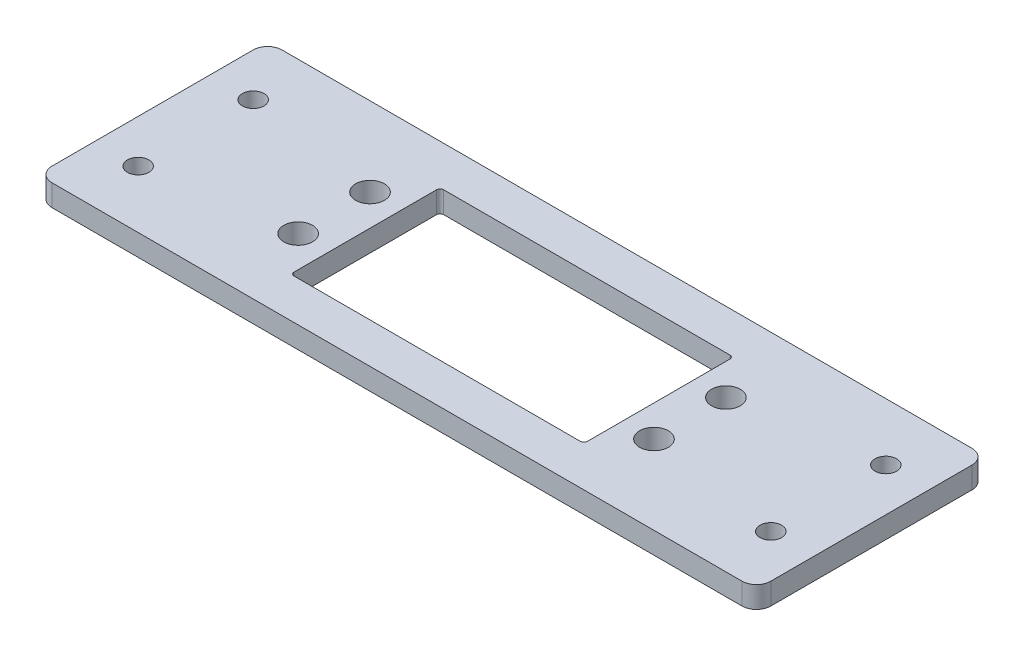
ISO-10303-21;
HEADER;
FILE_DESCRIPTION(('STEP AP214'),'2;1');
FILE_NAME('part.step','',(''),(''),'','','');
FILE_SCHEMA(('AUTOMOTIVE_DESIGN { 1 0 10303 214 1 1 1 1 }'));
ENDSEC;
DATA;
#1=APPLICATION_CONTEXT('core data for automotive mechanical design processes');
#2=APPLICATION_PROTOCOL_DEFINITION('international standard','automotive_design',2000,#1);
#3=PRODUCT_CONTEXT('',#1,'mechanical');
#4=PRODUCT('Part','Part','',(#3));
#5=PRODUCT_RELATED_PRODUCT_CATEGORY('part','',(#4));
#6=PRODUCT_DEFINITION_FORMATION('','',#4);
#7=PRODUCT_DEFINITION_CONTEXT('part definition',#1,'design');
#8=PRODUCT_DEFINITION('design','',#6,#7);
#9=PRODUCT_DEFINITION_SHAPE('','',#8);
#10=(LENGTH_UNIT() NAMED_UNIT(*) SI_UNIT(.MILLI.,.METRE.));
#11=(NAMED_UNIT(*) PLANE_ANGLE_UNIT() SI_UNIT($,.RADIAN.));
#12=(NAMED_UNIT(*) SI_UNIT($,.STERADIAN.) SOLID_ANGLE_UNIT());
#13=UNCERTAINTY_MEASURE_WITH_UNIT(LENGTH_MEASURE(1.E-05),#10,'distance_accuracy_value','');
#14=(GEOMETRIC_REPRESENTATION_CONTEXT(3) GLOBAL_UNCERTAINTY_ASSIGNED_CONTEXT((#13)) GLOBAL_UNIT_ASSIGNED_CONTEXT((#10,
#11,#12)) REPRESENTATION_CONTEXT('',''));
#15=CARTESIAN_POINT('',(0.,0.,0.));
#16=DIRECTION('',(0.,0.,1.));
#17=DIRECTION('',(1.,0.,0.));
#18=AXIS2_PLACEMENT_3D('',#15,#16,#17);
#19=CARTESIAN_POINT('',(0.,3.,0.));
#20=DIRECTION('',(0.,-1.,0.));
#21=DIRECTION('',(0.,0.,-1.));
#22=AXIS2_PLACEMENT_3D('',#19,#20,#21);
#23=PLANE('',#22);
#24=CARTESIAN_POINT('',(24.75,3.,-5.00000000000001));
#25=DIRECTION('',(0.,1.,0.));
#26=DIRECTION('',(0.,0.,1.));
#27=AXIS2_PLACEMENT_3D('',#24,#25,#26);
#28=CIRCLE('',#27,2.);
#29=CARTESIAN_POINT('',(24.75,3.,-3.));
#30=VERTEX_POINT('',#29);
#31=EDGE_CURVE('E281',#30,#30,#28,.T.);
#32=ORIENTED_EDGE('',*,*,#31,.F.);
#33=EDGE_LOOP('',(#32));
#34=FACE_BOUND('',#33,.T.);
#35=CARTESIAN_POINT('',(44.,3.,7.99999999999999));
#36=DIRECTION('',(0.,1.,0.));
#37=DIRECTION('',(0.,0.,1.));
#38=AXIS2_PLACEMENT_3D('',#35,#36,#37);
#39=CIRCLE('',#38,1.5);
#40=CARTESIAN_POINT('',(44.,3.,9.5));
#41=VERTEX_POINT('',#40);
#42=EDGE_CURVE('E275',#41,#41,#39,.T.);
#43=ORIENTED_EDGE('',*,*,#42,.F.);
#44=EDGE_LOOP('',(#43));
#45=FACE_BOUND('',#44,.T.);
#46=DIRECTION('',(0.,0.,-1.));
#47=VECTOR('',#46,1.);
#48=CARTESIAN_POINT('',(50.,3.,16.));
#49=LINE('',#48,#47);
#50=CARTESIAN_POINT('',(50.,3.,14.));
#51=VERTEX_POINT('',#50);
#52=CARTESIAN_POINT('',(50.,3.,-14.));
#53=VERTEX_POINT('',#52);
#54=EDGE_CURVE('E267',#51,#53,#49,.T.);
#55=ORIENTED_EDGE('',*,*,#54,.T.);
#56=CARTESIAN_POINT('',(48.,3.,-14.));
#57=DIRECTION('',(0.,-1.,0.));
#58=DIRECTION('',(0.,0.,-1.));
#59=AXIS2_PLACEMENT_3D('',#56,#57,#58);
#60=CIRCLE('',#59,2.);
#61=CARTESIAN_POINT('',(48.,3.,-16.));
#62=VERTEX_POINT('',#61);
#63=EDGE_CURVE('E240',#53,#62,#60,.F.);
#64=ORIENTED_EDGE('',*,*,#63,.T.);
#65=DIRECTION('',(-1.,0.,0.));
#66=VECTOR('',#65,1.);
#67=CARTESIAN_POINT('',(-50.,3.,-16.));
#68=LINE('',#67,#66);
#69=CARTESIAN_POINT('',(-48.,3.,-16.));
#70=VERTEX_POINT('',#69);
#71=EDGE_CURVE('E258',#62,#70,#68,.T.);
#72=ORIENTED_EDGE('',*,*,#71,.T.);
#73=CARTESIAN_POINT('',(-48.,3.,-14.));
#74=DIRECTION('',(0.,-1.,0.));
#75=DIRECTION('',(0.,0.,-1.));
#76=AXIS2_PLACEMENT_3D('',#73,#74,#75);
#77=CIRCLE('',#76,2.);
#78=CARTESIAN_POINT('',(-50.,3.,-14.));
#79=VERTEX_POINT('',#78);
#80=EDGE_CURVE('E236',#70,#79,#77,.F.);
#81=ORIENTED_EDGE('',*,*,#80,.T.);
#82=DIRECTION('',(0.,0.,1.));
#83=VECTOR('',#82,1.);
#84=CARTESIAN_POINT('',(-50.,3.,16.));
#85=LINE('',#84,#83);
#86=CARTESIAN_POINT('',(-50.,3.,14.));
#87=VERTEX_POINT('',#86);
#88=EDGE_CURVE('E186',#79,#87,#85,.T.);
#89=ORIENTED_EDGE('',*,*,#88,.T.);
#90=CARTESIAN_POINT('',(-48.,3.,14.));
#91=DIRECTION('',(0.,-1.,0.));
#92=DIRECTION('',(0.,0.,-1.));
#93=AXIS2_PLACEMENT_3D('',#90,#91,#92);
#94=CIRCLE('',#93,2.);
#95=CARTESIAN_POINT('',(-48.,3.,16.));
#96=VERTEX_POINT('',#95);
#97=EDGE_CURVE('E63',#87,#96,#94,.F.);
#98=ORIENTED_EDGE('',*,*,#97,.T.);
#99=DIRECTION('',(1.,0.,0.));
#100=VECTOR('',#99,1.);
#101=CARTESIAN_POINT('',(-50.,3.,16.));
#102=LINE('',#101,#100);
#103=CARTESIAN_POINT('',(48.,3.,16.));
#104=VERTEX_POINT('',#103);
#105=EDGE_CURVE('E182',#96,#104,#102,.T.);
#106=ORIENTED_EDGE('',*,*,#105,.T.);
#107=CARTESIAN_POINT('',(48.,3.,14.));
#108=DIRECTION('',(0.,-1.,0.));
#109=DIRECTION('',(0.,0.,-1.));
#110=AXIS2_PLACEMENT_3D('',#107,#108,#109);
#111=CIRCLE('',#110,2.);
#112=EDGE_CURVE('E238',#104,#51,#111,.F.);
#113=ORIENTED_EDGE('',*,*,#112,.T.);
#114=EDGE_LOOP('',(#55,#64,#72,#81,#89,#98,#106,#113));
#115=FACE_BOUND('',#114,.T.);
#116=DIRECTION('',(0.,0.,-1.));
#117=VECTOR('',#116,1.);
#118=CARTESIAN_POINT('',(20.4,3.,10.4));
#119=LINE('',#118,#117);
#120=CARTESIAN_POINT('',(20.4,3.,9.9));
#121=VERTEX_POINT('',#120);
#122=CARTESIAN_POINT('',(20.4,3.,-9.9));
#123=VERTEX_POINT('',#122);
#124=EDGE_CURVE('E178',#121,#123,#119,.T.);
#125=ORIENTED_EDGE('',*,*,#124,.F.);
#126=CARTESIAN_POINT('',(19.9,3.,9.9));
#127=DIRECTION('',(0.,-1.,0.));
#128=DIRECTION('',(0.,0.,-1.));
#129=AXIS2_PLACEMENT_3D('',#126,#127,#128);
#130=CIRCLE('',#129,0.5);
#131=CARTESIAN_POINT('',(19.9,3.,10.4));
#132=VERTEX_POINT('',#131);
#133=EDGE_CURVE('E168',#121,#132,#130,.T.);
#134=ORIENTED_EDGE('',*,*,#133,.T.);
#135=DIRECTION('',(1.,0.,0.));
#136=VECTOR('',#135,1.);
#137=CARTESIAN_POINT('',(-20.4,3.,10.4));
#138=LINE('',#137,#136);
#139=CARTESIAN_POINT('',(-19.9,3.,10.4));
#140=VERTEX_POINT('',#139);
#141=EDGE_CURVE('E287',#140,#132,#138,.T.);
#142=ORIENTED_EDGE('',*,*,#141,.F.);
#143=CARTESIAN_POINT('',(-19.9,3.,9.9));
#144=DIRECTION('',(0.,-1.,0.));
#145=DIRECTION('',(0.,0.,-1.));
#146=AXIS2_PLACEMENT_3D('',#143,#144,#145);
#147=CIRCLE('',#146,0.5);
#148=CARTESIAN_POINT('',(-20.4,3.,9.9));
#149=VERTEX_POINT('',#148);
#150=EDGE_CURVE('E167',#140,#149,#147,.T.);
#151=ORIENTED_EDGE('',*,*,#150,.T.);
#152=DIRECTION('',(0.,0.,1.));
#153=VECTOR('',#152,1.);
#154=CARTESIAN_POINT('',(-20.4,3.,10.4));
#155=LINE('',#154,#153);
#156=CARTESIAN_POINT('',(-20.4,3.,-9.9));
#157=VERTEX_POINT('',#156);
#158=EDGE_CURVE('E299',#157,#149,#155,.T.);
#159=ORIENTED_EDGE('',*,*,#158,.F.);
#160=CARTESIAN_POINT('',(-19.9,3.,-9.9));
#161=DIRECTION('',(0.,-1.,0.));
#162=DIRECTION('',(0.,0.,-1.));
#163=AXIS2_PLACEMENT_3D('',#160,#161,#162);
#164=CIRCLE('',#163,0.5);
#165=CARTESIAN_POINT('',(-19.9,3.,-10.4));
#166=VERTEX_POINT('',#165);
#167=EDGE_CURVE('E215',#157,#166,#164,.T.);
#168=ORIENTED_EDGE('',*,*,#167,.T.);
#169=DIRECTION('',(-1.,0.,0.));
#170=VECTOR('',#169,1.);
#171=CARTESIAN_POINT('',(-20.4,3.,-10.4));
#172=LINE('',#171,#170);
#173=CARTESIAN_POINT('',(19.9,3.,-10.4));
#174=VERTEX_POINT('',#173);
#175=EDGE_CURVE('E302',#174,#166,#172,.T.);
#176=ORIENTED_EDGE('',*,*,#175,.F.);
#177=CARTESIAN_POINT('',(19.9,3.,-9.9));
#178=DIRECTION('',(0.,-1.,0.));
#179=DIRECTION('',(0.,0.,-1.));
#180=AXIS2_PLACEMENT_3D('',#177,#178,#179);
#181=CIRCLE('',#180,0.5);
#182=EDGE_CURVE('E211',#174,#123,#181,.T.);
#183=ORIENTED_EDGE('',*,*,#182,.T.);
#184=EDGE_LOOP('',(#125,#134,#142,#151,#159,#168,#176,#183));
#185=FACE_BOUND('',#184,.T.);
#186=CARTESIAN_POINT('',(24.75,3.,4.99999999999999));
#187=DIRECTION('',(0.,1.,0.));
#188=DIRECTION('',(0.,0.,-1.));
#189=AXIS2_PLACEMENT_3D('',#186,#187,#188);
#190=CIRCLE('',#189,2.);
#191=CARTESIAN_POINT('',(24.75,3.,2.99999999999999));
#192=VERTEX_POINT('',#191);
#193=EDGE_CURVE('E297',#192,#192,#190,.T.);
#194=ORIENTED_EDGE('',*,*,#193,.F.);
#195=EDGE_LOOP('',(#194));
#196=FACE_BOUND('',#195,.T.);
#197=CARTESIAN_POINT('',(-24.75,3.,4.99999999999999));
#198=DIRECTION('',(0.,1.,0.));
#199=DIRECTION('',(0.,0.,1.));
#200=AXIS2_PLACEMENT_3D('',#197,#198,#199);
#201=CIRCLE('',#200,2.);
#202=CARTESIAN_POINT('',(-24.75,3.,7.));
#203=VERTEX_POINT('',#202);
#204=EDGE_CURVE('E310',#203,#203,#201,.T.);
#205=ORIENTED_EDGE('',*,*,#204,.F.);
#206=EDGE_LOOP('',(#205));
#207=FACE_BOUND('',#206,.T.);
#208=CARTESIAN_POINT('',(-24.75,3.,-5.00000000000001));
#209=DIRECTION('',(0.,1.,0.));
#210=DIRECTION('',(0.,0.,-1.));
#211=AXIS2_PLACEMENT_3D('',#208,#209,#210);
#212=CIRCLE('',#211,2.);
#213=CARTESIAN_POINT('',(-24.75,3.,-7.00000000000001));
#214=VERTEX_POINT('',#213);
#215=EDGE_CURVE('E316',#214,#214,#212,.T.);
#216=ORIENTED_EDGE('',*,*,#215,.F.);
#217=EDGE_LOOP('',(#216));
#218=FACE_BOUND('',#217,.T.);
#219=CARTESIAN_POINT('',(-44.,3.,-8.00000000000001));
#220=DIRECTION('',(0.,1.,0.));
#221=DIRECTION('',(0.,0.,1.));
#222=AXIS2_PLACEMENT_3D('',#219,#220,#221);
#223=CIRCLE('',#222,1.5);
#224=CARTESIAN_POINT('',(-44.,3.,-6.5));
#225=VERTEX_POINT('',#224);
#226=EDGE_CURVE('E322',#225,#225,#223,.T.);
#227=ORIENTED_EDGE('',*,*,#226,.F.);
#228=EDGE_LOOP('',(#227));
#229=FACE_BOUND('',#228,.T.);
#230=CARTESIAN_POINT('',(44.,3.,-8.00000000000001));
#231=DIRECTION('',(0.,1.,0.));
#232=DIRECTION('',(0.,0.,-1.));
#233=AXIS2_PLACEMENT_3D('',#230,#231,#232);
#234=CIRCLE('',#233,1.5);
#235=CARTESIAN_POINT('',(44.,3.,-9.50000000000001));
#236=VERTEX_POINT('',#235);
#237=EDGE_CURVE('E328',#236,#236,#234,.T.);
#238=ORIENTED_EDGE('',*,*,#237,.F.);
#239=EDGE_LOOP('',(#238));
#240=FACE_BOUND('',#239,.T.);
#241=CARTESIAN_POINT('',(-44.,3.,7.99999999999999));
#242=DIRECTION('',(0.,1.,0.));
#243=DIRECTION('',(0.,0.,-1.));
#244=AXIS2_PLACEMENT_3D('',#241,#242,#243);
#245=CIRCLE('',#244,1.5);
#246=CARTESIAN_POINT('',(-44.,3.,6.49999999999999));
#247=VERTEX_POINT('',#246);
#248=EDGE_CURVE('E334',#247,#247,#245,.T.);
#249=ORIENTED_EDGE('',*,*,#248,.F.);
#250=EDGE_LOOP('',(#249));
#251=FACE_BOUND('',#250,.T.);
#252=ADVANCED_FACE('F41',(#34,#45,#115,#185,#196,#207,#218,#229,#240,#251),#23,.F.);
#253=CARTESIAN_POINT('',(0.,0.,0.));
#254=DIRECTION('',(0.,-1.,0.));
#255=DIRECTION('',(0.,0.,-1.));
#256=AXIS2_PLACEMENT_3D('',#253,#254,#255);
#257=PLANE('',#256);
#258=CARTESIAN_POINT('',(44.,0.,-8.00000000000001));
#259=DIRECTION('',(0.,1.,0.));
#260=DIRECTION('',(0.,0.,-1.));
#261=AXIS2_PLACEMENT_3D('',#258,#259,#260);
#262=CIRCLE('',#261,1.5);
#263=CARTESIAN_POINT('',(44.,0.,-9.50000000000001));
#264=VERTEX_POINT('',#263);
#265=EDGE_CURVE('E331',#264,#264,#262,.T.);
#266=ORIENTED_EDGE('',*,*,#265,.T.);
#267=EDGE_LOOP('',(#266));
#268=FACE_BOUND('',#267,.T.);
#269=CARTESIAN_POINT('',(-24.75,0.,-5.00000000000001));
#270=DIRECTION('',(0.,1.,0.));
#271=DIRECTION('',(0.,0.,-1.));
#272=AXIS2_PLACEMENT_3D('',#269,#270,#271);
#273=CIRCLE('',#272,2.);
#274=CARTESIAN_POINT('',(-24.75,0.,-7.00000000000001));
#275=VERTEX_POINT('',#274);
#276=EDGE_CURVE('E319',#275,#275,#273,.T.);
#277=ORIENTED_EDGE('',*,*,#276,.T.);
#278=EDGE_LOOP('',(#277));
#279=FACE_BOUND('',#278,.T.);
#280=CARTESIAN_POINT('',(24.75,0.,4.99999999999999));
#281=DIRECTION('',(0.,1.,0.));
#282=DIRECTION('',(0.,0.,-1.));
#283=AXIS2_PLACEMENT_3D('',#280,#281,#282);
#284=CIRCLE('',#283,2.);
#285=CARTESIAN_POINT('',(24.75,0.,2.99999999999999));
#286=VERTEX_POINT('',#285);
#287=EDGE_CURVE('E307',#286,#286,#284,.T.);
#288=ORIENTED_EDGE('',*,*,#287,.T.);
#289=EDGE_LOOP('',(#288));
#290=FACE_BOUND('',#289,.T.);
#291=CARTESIAN_POINT('',(44.,0.,7.99999999999999));
#292=DIRECTION('',(0.,1.,0.));
#293=DIRECTION('',(0.,0.,1.));
#294=AXIS2_PLACEMENT_3D('',#291,#292,#293);
#295=CIRCLE('',#294,1.5);
#296=CARTESIAN_POINT('',(44.,0.,9.5));
#297=VERTEX_POINT('',#296);
#298=EDGE_CURVE('E278',#297,#297,#295,.T.);
#299=ORIENTED_EDGE('',*,*,#298,.T.);
#300=EDGE_LOOP('',(#299));
#301=FACE_BOUND('',#300,.T.);
#302=DIRECTION('',(-1.,0.,0.));
#303=VECTOR('',#302,1.);
#304=CARTESIAN_POINT('',(-50.,0.,-16.));
#305=LINE('',#304,#303);
#306=CARTESIAN_POINT('',(48.,0.,-16.));
#307=VERTEX_POINT('',#306);
#308=CARTESIAN_POINT('',(-48.,0.,-16.));
#309=VERTEX_POINT('',#308);
#310=EDGE_CURVE('E269',#307,#309,#305,.T.);
#311=ORIENTED_EDGE('',*,*,#310,.F.);
#312=CARTESIAN_POINT('',(48.,0.,-14.));
#313=DIRECTION('',(0.,-1.,0.));
#314=DIRECTION('',(0.,0.,-1.));
#315=AXIS2_PLACEMENT_3D('',#312,#313,#314);
#316=CIRCLE('',#315,2.);
#317=CARTESIAN_POINT('',(50.,0.,-14.));
#318=VERTEX_POINT('',#317);
#319=EDGE_CURVE('E228',#307,#318,#316,.T.);
#320=ORIENTED_EDGE('',*,*,#319,.T.);
#321=DIRECTION('',(0.,0.,-1.));
#322=VECTOR('',#321,1.);
#323=CARTESIAN_POINT('',(50.,0.,16.));
#324=LINE('',#323,#322);
#325=CARTESIAN_POINT('',(50.,0.,14.));
#326=VERTEX_POINT('',#325);
#327=EDGE_CURVE('E271',#326,#318,#324,.T.);
#328=ORIENTED_EDGE('',*,*,#327,.F.);
#329=CARTESIAN_POINT('',(48.,0.,14.));
#330=DIRECTION('',(0.,-1.,0.));
#331=DIRECTION('',(0.,0.,-1.));
#332=AXIS2_PLACEMENT_3D('',#329,#330,#331);
#333=CIRCLE('',#332,2.);
#334=CARTESIAN_POINT('',(48.,0.,16.));
#335=VERTEX_POINT('',#334);
#336=EDGE_CURVE('E226',#326,#335,#333,.T.);
#337=ORIENTED_EDGE('',*,*,#336,.T.);
#338=DIRECTION('',(1.,0.,0.));
#339=VECTOR('',#338,1.);
#340=CARTESIAN_POINT('',(-50.,0.,16.));
#341=LINE('',#340,#339);
#342=CARTESIAN_POINT('',(-48.,0.,16.));
#343=VERTEX_POINT('',#342);
#344=EDGE_CURVE('E189',#343,#335,#341,.T.);
#345=ORIENTED_EDGE('',*,*,#344,.F.);
#346=CARTESIAN_POINT('',(-48.,0.,14.));
#347=DIRECTION('',(0.,-1.,0.));
#348=DIRECTION('',(0.,0.,-1.));
#349=AXIS2_PLACEMENT_3D('',#346,#347,#348);
#350=CIRCLE('',#349,2.);
#351=CARTESIAN_POINT('',(-50.,0.,14.));
#352=VERTEX_POINT('',#351);
#353=EDGE_CURVE('E222',#343,#352,#350,.T.);
#354=ORIENTED_EDGE('',*,*,#353,.T.);
#355=DIRECTION('',(0.,0.,1.));
#356=VECTOR('',#355,1.);
#357=CARTESIAN_POINT('',(-50.,0.,16.));
#358=LINE('',#357,#356);
#359=CARTESIAN_POINT('',(-50.,0.,-14.));
#360=VERTEX_POINT('',#359);
#361=EDGE_CURVE('E252',#360,#352,#358,.T.);
#362=ORIENTED_EDGE('',*,*,#361,.F.);
#363=CARTESIAN_POINT('',(-48.,0.,-14.));
#364=DIRECTION('',(0.,-1.,0.));
#365=DIRECTION('',(0.,0.,-1.));
#366=AXIS2_PLACEMENT_3D('',#363,#364,#365);
#367=CIRCLE('',#366,2.);
#368=EDGE_CURVE('E224',#360,#309,#367,.T.);
#369=ORIENTED_EDGE('',*,*,#368,.T.);
#370=EDGE_LOOP('',(#311,#320,#328,#337,#345,#354,#362,#369));
#371=FACE_BOUND('',#370,.T.);
#372=CARTESIAN_POINT('',(24.75,0.,-5.00000000000001));
#373=DIRECTION('',(0.,1.,0.));
#374=DIRECTION('',(0.,0.,1.));
#375=AXIS2_PLACEMENT_3D('',#372,#373,#374);
#376=CIRCLE('',#375,2.);
#377=CARTESIAN_POINT('',(24.75,0.,-3.));
#378=VERTEX_POINT('',#377);
#379=EDGE_CURVE('E284',#378,#378,#376,.T.);
#380=ORIENTED_EDGE('',*,*,#379,.T.);
#381=EDGE_LOOP('',(#380));
#382=FACE_BOUND('',#381,.T.);
#383=DIRECTION('',(0.,0.,1.));
#384=VECTOR('',#383,1.);
#385=CARTESIAN_POINT('',(-20.4,0.,10.4));
#386=LINE('',#385,#384);
#387=CARTESIAN_POINT('',(-20.4,0.,-9.9));
#388=VERTEX_POINT('',#387);
#389=CARTESIAN_POINT('',(-20.4,0.,9.9));
#390=VERTEX_POINT('',#389);
#391=EDGE_CURVE('E162',#388,#390,#386,.T.);
#392=ORIENTED_EDGE('',*,*,#391,.T.);
#393=CARTESIAN_POINT('',(-19.9,0.,9.9));
#394=DIRECTION('',(0.,-1.,0.));
#395=DIRECTION('',(0.,0.,-1.));
#396=AXIS2_PLACEMENT_3D('',#393,#394,#395);
#397=CIRCLE('',#396,0.5);
#398=CARTESIAN_POINT('',(-19.9,0.,10.4));
#399=VERTEX_POINT('',#398);
#400=EDGE_CURVE('E156',#390,#399,#397,.F.);
#401=ORIENTED_EDGE('',*,*,#400,.T.);
#402=DIRECTION('',(1.,0.,0.));
#403=VECTOR('',#402,1.);
#404=CARTESIAN_POINT('',(-20.4,0.,10.4));
#405=LINE('',#404,#403);
#406=CARTESIAN_POINT('',(19.9,0.,10.4));
#407=VERTEX_POINT('',#406);
#408=EDGE_CURVE('E160',#399,#407,#405,.T.);
#409=ORIENTED_EDGE('',*,*,#408,.T.);
#410=CARTESIAN_POINT('',(19.9,0.,9.9));
#411=DIRECTION('',(0.,-1.,0.));
#412=DIRECTION('',(0.,0.,-1.));
#413=AXIS2_PLACEMENT_3D('',#410,#411,#412);
#414=CIRCLE('',#413,0.5);
#415=CARTESIAN_POINT('',(20.4,0.,9.9));
#416=VERTEX_POINT('',#415);
#417=EDGE_CURVE('E205',#407,#416,#414,.F.);
#418=ORIENTED_EDGE('',*,*,#417,.T.);
#419=DIRECTION('',(0.,0.,-1.));
#420=VECTOR('',#419,1.);
#421=CARTESIAN_POINT('',(20.4,0.,10.4));
#422=LINE('',#421,#420);
#423=CARTESIAN_POINT('',(20.4,0.,-9.9));
#424=VERTEX_POINT('',#423);
#425=EDGE_CURVE('E294',#416,#424,#422,.T.);
#426=ORIENTED_EDGE('',*,*,#425,.T.);
#427=CARTESIAN_POINT('',(19.9,0.,-9.9));
#428=DIRECTION('',(0.,-1.,0.));
#429=DIRECTION('',(0.,0.,-1.));
#430=AXIS2_PLACEMENT_3D('',#427,#428,#429);
#431=CIRCLE('',#430,0.5);
#432=CARTESIAN_POINT('',(19.9,0.,-10.4));
#433=VERTEX_POINT('',#432);
#434=EDGE_CURVE('E209',#424,#433,#431,.F.);
#435=ORIENTED_EDGE('',*,*,#434,.T.);
#436=DIRECTION('',(-1.,0.,0.));
#437=VECTOR('',#436,1.);
#438=CARTESIAN_POINT('',(-20.4,0.,-10.4));
#439=LINE('',#438,#437);
#440=CARTESIAN_POINT('',(-19.9,0.,-10.4));
#441=VERTEX_POINT('',#440);
#442=EDGE_CURVE('E291',#433,#441,#439,.T.);
#443=ORIENTED_EDGE('',*,*,#442,.T.);
#444=CARTESIAN_POINT('',(-19.9,0.,-9.9));
#445=DIRECTION('',(0.,-1.,0.));
#446=DIRECTION('',(0.,0.,-1.));
#447=AXIS2_PLACEMENT_3D('',#444,#445,#446);
#448=CIRCLE('',#447,0.5);
#449=EDGE_CURVE('E213',#441,#388,#448,.F.);
#450=ORIENTED_EDGE('',*,*,#449,.T.);
#451=EDGE_LOOP('',(#392,#401,#409,#418,#426,#435,#443,#450));
#452=FACE_BOUND('',#451,.T.);
#453=CARTESIAN_POINT('',(-24.75,0.,4.99999999999999));
#454=DIRECTION('',(0.,1.,0.));
#455=DIRECTION('',(0.,0.,1.));
#456=AXIS2_PLACEMENT_3D('',#453,#454,#455);
#457=CIRCLE('',#456,2.);
#458=CARTESIAN_POINT('',(-24.75,0.,7.));
#459=VERTEX_POINT('',#458);
#460=EDGE_CURVE('E313',#459,#459,#457,.T.);
#461=ORIENTED_EDGE('',*,*,#460,.T.);
#462=EDGE_LOOP('',(#461));
#463=FACE_BOUND('',#462,.T.);
#464=CARTESIAN_POINT('',(-44.,0.,-8.00000000000001));
#465=DIRECTION('',(0.,1.,0.));
#466=DIRECTION('',(0.,0.,1.));
#467=AXIS2_PLACEMENT_3D('',#464,#465,#466);
#468=CIRCLE('',#467,1.5);
#469=CARTESIAN_POINT('',(-44.,0.,-6.5));
#470=VERTEX_POINT('',#469);
#471=EDGE_CURVE('E325',#470,#470,#468,.T.);
#472=ORIENTED_EDGE('',*,*,#471,.T.);
#473=EDGE_LOOP('',(#472));
#474=FACE_BOUND('',#473,.T.);
#475=CARTESIAN_POINT('',(-44.,0.,7.99999999999999));
#476=DIRECTION('',(0.,1.,0.));
#477=DIRECTION('',(0.,0.,-1.));
#478=AXIS2_PLACEMENT_3D('',#475,#476,#477);
#479=CIRCLE('',#478,1.5);
#480=CARTESIAN_POINT('',(-44.,0.,6.49999999999999));
#481=VERTEX_POINT('',#480);
#482=EDGE_CURVE('E337',#481,#481,#479,.T.);
#483=ORIENTED_EDGE('',*,*,#482,.T.);
#484=EDGE_LOOP('',(#483));
#485=FACE_BOUND('',#484,.T.);
#486=ADVANCED_FACE('F158',(#268,#279,#290,#301,#371,#382,#452,#463,#474,#485),#257,.T.);
#487=CARTESIAN_POINT('',(50.,3.,16.));
#488=DIRECTION('',(-1.,0.,0.));
#489=DIRECTION('',(0.,0.,1.));
#490=AXIS2_PLACEMENT_3D('',#487,#488,#489);
#491=PLANE('',#490);
#492=ORIENTED_EDGE('',*,*,#327,.T.);
#493=DIRECTION('',(0.,-1.,0.));
#494=VECTOR('',#493,1.);
#495=CARTESIAN_POINT('',(50.,3.,-14.));
#496=LINE('',#495,#494);
#497=EDGE_CURVE('E233',#318,#53,#496,.F.);
#498=ORIENTED_EDGE('',*,*,#497,.T.);
#499=ORIENTED_EDGE('',*,*,#54,.F.);
#500=DIRECTION('',(0.,-1.,0.));
#501=VECTOR('',#500,1.);
#502=CARTESIAN_POINT('',(50.,3.,14.));
#503=LINE('',#502,#501);
#504=EDGE_CURVE('E230',#51,#326,#503,.T.);
#505=ORIENTED_EDGE('',*,*,#504,.T.);
#506=EDGE_LOOP('',(#492,#498,#499,#505));
#507=FACE_BOUND('',#506,.T.);
#508=ADVANCED_FACE('F352',(#507),#491,.F.);
#509=CARTESIAN_POINT('',(-50.,3.,-16.));
#510=DIRECTION('',(0.,0.,1.));
#511=DIRECTION('',(1.,0.,0.));
#512=AXIS2_PLACEMENT_3D('',#509,#510,#511);
#513=PLANE('',#512);
#514=ORIENTED_EDGE('',*,*,#71,.F.);
#515=DIRECTION('',(0.,-1.,0.));
#516=VECTOR('',#515,1.);
#517=CARTESIAN_POINT('',(48.,3.,-16.));
#518=LINE('',#517,#516);
#519=EDGE_CURVE('E219',#62,#307,#518,.T.);
#520=ORIENTED_EDGE('',*,*,#519,.T.);
#521=ORIENTED_EDGE('',*,*,#310,.T.);
#522=DIRECTION('',(0.,-1.,0.));
#523=VECTOR('',#522,1.);
#524=CARTESIAN_POINT('',(-48.,3.,-16.));
#525=LINE('',#524,#523);
#526=EDGE_CURVE('E217',#309,#70,#525,.F.);
#527=ORIENTED_EDGE('',*,*,#526,.T.);
#528=EDGE_LOOP('',(#514,#520,#521,#527));
#529=FACE_BOUND('',#528,.T.);
#530=ADVANCED_FACE('F365',(#529),#513,.F.);
#531=CARTESIAN_POINT('',(-50.,3.,16.));
#532=DIRECTION('',(1.,0.,0.));
#533=DIRECTION('',(0.,0.,-1.));
#534=AXIS2_PLACEMENT_3D('',#531,#532,#533);
#535=PLANE('',#534);
#536=ORIENTED_EDGE('',*,*,#88,.F.);
#537=DIRECTION('',(0.,-1.,0.));
#538=VECTOR('',#537,1.);
#539=CARTESIAN_POINT('',(-50.,3.,-14.));
#540=LINE('',#539,#538);
#541=EDGE_CURVE('E11',#79,#360,#540,.T.);
#542=ORIENTED_EDGE('',*,*,#541,.T.);
#543=ORIENTED_EDGE('',*,*,#361,.T.);
#544=DIRECTION('',(0.,-1.,0.));
#545=VECTOR('',#544,1.);
#546=CARTESIAN_POINT('',(-50.,3.,14.));
#547=LINE('',#546,#545);
#548=EDGE_CURVE('E49',#352,#87,#547,.F.);
#549=ORIENTED_EDGE('',*,*,#548,.T.);
#550=EDGE_LOOP('',(#536,#542,#543,#549));
#551=FACE_BOUND('',#550,.T.);
#552=ADVANCED_FACE('F249',(#551),#535,.F.);
#553=CARTESIAN_POINT('',(-50.,3.,16.));
#554=DIRECTION('',(0.,0.,-1.));
#555=DIRECTION('',(-1.,0.,0.));
#556=AXIS2_PLACEMENT_3D('',#553,#554,#555);
#557=PLANE('',#556);
#558=ORIENTED_EDGE('',*,*,#344,.T.);
#559=DIRECTION('',(0.,-1.,0.));
#560=VECTOR('',#559,1.);
#561=CARTESIAN_POINT('',(48.,3.,16.));
#562=LINE('',#561,#560);
#563=EDGE_CURVE('E56',#335,#104,#562,.F.);
#564=ORIENTED_EDGE('',*,*,#563,.T.);
#565=ORIENTED_EDGE('',*,*,#105,.F.);
#566=DIRECTION('',(0.,-1.,0.));
#567=VECTOR('',#566,1.);
#568=CARTESIAN_POINT('',(-48.,3.,16.));
#569=LINE('',#568,#567);
#570=EDGE_CURVE('E242',#96,#343,#569,.T.);
#571=ORIENTED_EDGE('',*,*,#570,.T.);
#572=EDGE_LOOP('',(#558,#564,#565,#571));
#573=FACE_BOUND('',#572,.T.);
#574=ADVANCED_FACE('F262',(#573),#557,.F.);
#575=CARTESIAN_POINT('',(44.,3.,7.99999999999999));
#576=DIRECTION('',(0.,-1.,0.));
#577=DIRECTION('',(0.,0.,-1.));
#578=AXIS2_PLACEMENT_3D('',#575,#576,#577);
#579=CYLINDRICAL_SURFACE('',#578,1.5);
#580=ORIENTED_EDGE('',*,*,#42,.T.);
#581=EDGE_LOOP('',(#580));
#582=FACE_BOUND('',#581,.T.);
#583=ORIENTED_EDGE('',*,*,#298,.F.);
#584=EDGE_LOOP('',(#583));
#585=FACE_BOUND('',#584,.T.);
#586=ADVANCED_FACE('F358',(#582,#585),#579,.F.);
#587=CARTESIAN_POINT('',(24.75,3.,-5.00000000000001));
#588=DIRECTION('',(0.,-1.,0.));
#589=DIRECTION('',(0.,0.,-1.));
#590=AXIS2_PLACEMENT_3D('',#587,#588,#589);
#591=CYLINDRICAL_SURFACE('',#590,2.);
#592=ORIENTED_EDGE('',*,*,#31,.T.);
#593=EDGE_LOOP('',(#592));
#594=FACE_BOUND('',#593,.T.);
#595=ORIENTED_EDGE('',*,*,#379,.F.);
#596=EDGE_LOOP('',(#595));
#597=FACE_BOUND('',#596,.T.);
#598=ADVANCED_FACE('F545',(#594,#597),#591,.F.);
#599=CARTESIAN_POINT('',(20.4,3.,10.4));
#600=DIRECTION('',(-1.,0.,0.));
#601=DIRECTION('',(0.,0.,1.));
#602=AXIS2_PLACEMENT_3D('',#599,#600,#601);
#603=PLANE('',#602);
#604=ORIENTED_EDGE('',*,*,#425,.F.);
#605=DIRECTION('',(0.,-1.,0.));
#606=VECTOR('',#605,1.);
#607=CARTESIAN_POINT('',(20.4,3.,9.9));
#608=LINE('',#607,#606);
#609=EDGE_CURVE('E194',#416,#121,#608,.F.);
#610=ORIENTED_EDGE('',*,*,#609,.T.);
#611=ORIENTED_EDGE('',*,*,#124,.T.);
#612=DIRECTION('',(0.,-1.,0.));
#613=VECTOR('',#612,1.);
#614=CARTESIAN_POINT('',(20.4,0.,-9.9));
#615=LINE('',#614,#613);
#616=EDGE_CURVE('E184',#123,#424,#615,.T.);
#617=ORIENTED_EDGE('',*,*,#616,.T.);
#618=EDGE_LOOP('',(#604,#610,#611,#617));
#619=FACE_BOUND('',#618,.T.);
#620=ADVANCED_FACE('F534',(#619),#603,.T.);
#621=CARTESIAN_POINT('',(-20.4,3.,-10.4));
#622=DIRECTION('',(0.,0.,1.));
#623=DIRECTION('',(1.,0.,0.));
#624=AXIS2_PLACEMENT_3D('',#621,#622,#623);
#625=PLANE('',#624);
#626=ORIENTED_EDGE('',*,*,#442,.F.);
#627=DIRECTION('',(0.,-1.,0.));
#628=VECTOR('',#627,1.);
#629=CARTESIAN_POINT('',(19.9,3.,-10.4));
#630=LINE('',#629,#628);
#631=EDGE_CURVE('E203',#433,#174,#630,.F.);
#632=ORIENTED_EDGE('',*,*,#631,.T.);
#633=ORIENTED_EDGE('',*,*,#175,.T.);
#634=DIRECTION('',(0.,-1.,0.));
#635=VECTOR('',#634,1.);
#636=CARTESIAN_POINT('',(-19.9,0.,-10.4));
#637=LINE('',#636,#635);
#638=EDGE_CURVE('E200',#166,#441,#637,.T.);
#639=ORIENTED_EDGE('',*,*,#638,.T.);
#640=EDGE_LOOP('',(#626,#632,#633,#639));
#641=FACE_BOUND('',#640,.T.);
#642=ADVANCED_FACE('F523',(#641),#625,.T.);
#643=CARTESIAN_POINT('',(-20.4,3.,10.4));
#644=DIRECTION('',(1.,0.,0.));
#645=DIRECTION('',(0.,0.,-1.));
#646=AXIS2_PLACEMENT_3D('',#643,#644,#645);
#647=PLANE('',#646);
#648=ORIENTED_EDGE('',*,*,#158,.T.);
#649=DIRECTION('',(0.,-1.,0.));
#650=VECTOR('',#649,1.);
#651=CARTESIAN_POINT('',(-20.4,0.,9.9));
#652=LINE('',#651,#650);
#653=EDGE_CURVE('E198',#149,#390,#652,.T.);
#654=ORIENTED_EDGE('',*,*,#653,.T.);
#655=ORIENTED_EDGE('',*,*,#391,.F.);
#656=DIRECTION('',(0.,-1.,0.));
#657=VECTOR('',#656,1.);
#658=CARTESIAN_POINT('',(-20.4,3.,-9.9));
#659=LINE('',#658,#657);
#660=EDGE_CURVE('E196',#388,#157,#659,.F.);
#661=ORIENTED_EDGE('',*,*,#660,.T.);
#662=EDGE_LOOP('',(#648,#654,#655,#661));
#663=FACE_BOUND('',#662,.T.);
#664=ADVANCED_FACE('F511',(#663),#647,.T.);
#665=CARTESIAN_POINT('',(-20.4,3.,10.4));
#666=DIRECTION('',(0.,0.,-1.));
#667=DIRECTION('',(-1.,0.,0.));
#668=AXIS2_PLACEMENT_3D('',#665,#666,#667);
#669=PLANE('',#668);
#670=ORIENTED_EDGE('',*,*,#141,.T.);
#671=DIRECTION('',(0.,-1.,0.));
#672=VECTOR('',#671,1.);
#673=CARTESIAN_POINT('',(19.9,0.,10.4));
#674=LINE('',#673,#672);
#675=EDGE_CURVE('E177',#132,#407,#674,.T.);
#676=ORIENTED_EDGE('',*,*,#675,.T.);
#677=ORIENTED_EDGE('',*,*,#408,.F.);
#678=DIRECTION('',(0.,-1.,0.));
#679=VECTOR('',#678,1.);
#680=CARTESIAN_POINT('',(-19.9,3.,10.4));
#681=LINE('',#680,#679);
#682=EDGE_CURVE('E174',#399,#140,#681,.F.);
#683=ORIENTED_EDGE('',*,*,#682,.T.);
#684=EDGE_LOOP('',(#670,#676,#677,#683));
#685=FACE_BOUND('',#684,.T.);
#686=ADVANCED_FACE('F173',(#685),#669,.T.);
#687=CARTESIAN_POINT('',(24.75,3.,4.99999999999999));
#688=DIRECTION('',(0.,-1.,0.));
#689=DIRECTION('',(0.,0.,-1.));
#690=AXIS2_PLACEMENT_3D('',#687,#688,#689);
#691=CYLINDRICAL_SURFACE('',#690,2.);
#692=ORIENTED_EDGE('',*,*,#193,.T.);
#693=EDGE_LOOP('',(#692));
#694=FACE_BOUND('',#693,.T.);
#695=ORIENTED_EDGE('',*,*,#287,.F.);
#696=EDGE_LOOP('',(#695));
#697=FACE_BOUND('',#696,.T.);
#698=ADVANCED_FACE('F510',(#694,#697),#691,.F.);
#699=CARTESIAN_POINT('',(-24.75,3.,4.99999999999999));
#700=DIRECTION('',(0.,-1.,0.));
#701=DIRECTION('',(0.,0.,-1.));
#702=AXIS2_PLACEMENT_3D('',#699,#700,#701);
#703=CYLINDRICAL_SURFACE('',#702,2.);
#704=ORIENTED_EDGE('',*,*,#204,.T.);
#705=EDGE_LOOP('',(#704));
#706=FACE_BOUND('',#705,.T.);
#707=ORIENTED_EDGE('',*,*,#460,.F.);
#708=EDGE_LOOP('',(#707));
#709=FACE_BOUND('',#708,.T.);
#710=ADVANCED_FACE('F588',(#706,#709),#703,.F.);
#711=CARTESIAN_POINT('',(-24.75,3.,-5.00000000000001));
#712=DIRECTION('',(0.,-1.,0.));
#713=DIRECTION('',(0.,0.,-1.));
#714=AXIS2_PLACEMENT_3D('',#711,#712,#713);
#715=CYLINDRICAL_SURFACE('',#714,2.);
#716=ORIENTED_EDGE('',*,*,#215,.T.);
#717=EDGE_LOOP('',(#716));
#718=FACE_BOUND('',#717,.T.);
#719=ORIENTED_EDGE('',*,*,#276,.F.);
#720=EDGE_LOOP('',(#719));
#721=FACE_BOUND('',#720,.T.);
#722=ADVANCED_FACE('F577',(#718,#721),#715,.F.);
#723=CARTESIAN_POINT('',(-44.,3.,-8.00000000000001));
#724=DIRECTION('',(0.,-1.,0.));
#725=DIRECTION('',(0.,0.,-1.));
#726=AXIS2_PLACEMENT_3D('',#723,#724,#725);
#727=CYLINDRICAL_SURFACE('',#726,1.5);
#728=ORIENTED_EDGE('',*,*,#226,.T.);
#729=EDGE_LOOP('',(#728));
#730=FACE_BOUND('',#729,.T.);
#731=ORIENTED_EDGE('',*,*,#471,.F.);
#732=EDGE_LOOP('',(#731));
#733=FACE_BOUND('',#732,.T.);
#734=ADVANCED_FACE('F566',(#730,#733),#727,.F.);
#735=CARTESIAN_POINT('',(44.,3.,-8.00000000000001));
#736=DIRECTION('',(0.,-1.,0.));
#737=DIRECTION('',(0.,0.,-1.));
#738=AXIS2_PLACEMENT_3D('',#735,#736,#737);
#739=CYLINDRICAL_SURFACE('',#738,1.5);
#740=ORIENTED_EDGE('',*,*,#237,.T.);
#741=EDGE_LOOP('',(#740));
#742=FACE_BOUND('',#741,.T.);
#743=ORIENTED_EDGE('',*,*,#265,.F.);
#744=EDGE_LOOP('',(#743));
#745=FACE_BOUND('',#744,.T.);
#746=ADVANCED_FACE('F556',(#742,#745),#739,.F.);
#747=CARTESIAN_POINT('',(-44.,3.,7.99999999999999));
#748=DIRECTION('',(0.,-1.,0.));
#749=DIRECTION('',(0.,0.,-1.));
#750=AXIS2_PLACEMENT_3D('',#747,#748,#749);
#751=CYLINDRICAL_SURFACE('',#750,1.5);
#752=ORIENTED_EDGE('',*,*,#248,.T.);
#753=EDGE_LOOP('',(#752));
#754=FACE_BOUND('',#753,.T.);
#755=ORIENTED_EDGE('',*,*,#482,.F.);
#756=EDGE_LOOP('',(#755));
#757=FACE_BOUND('',#756,.T.);
#758=ADVANCED_FACE('F343',(#754,#757),#751,.F.);
#759=CARTESIAN_POINT('',(19.9,3.,9.9));
#760=DIRECTION('',(0.,1.,0.));
#761=DIRECTION('',(0.,0.,1.));
#762=AXIS2_PLACEMENT_3D('',#759,#760,#761);
#763=CYLINDRICAL_SURFACE('',#762,0.5);
#764=ORIENTED_EDGE('',*,*,#133,.F.);
#765=ORIENTED_EDGE('',*,*,#609,.F.);
#766=ORIENTED_EDGE('',*,*,#417,.F.);
#767=ORIENTED_EDGE('',*,*,#675,.F.);
#768=EDGE_LOOP('',(#764,#765,#766,#767));
#769=FACE_BOUND('',#768,.T.);
#770=ADVANCED_FACE('F372',(#769),#763,.F.);
#771=CARTESIAN_POINT('',(-19.9,3.,9.9));
#772=DIRECTION('',(0.,1.,0.));
#773=DIRECTION('',(0.,0.,1.));
#774=AXIS2_PLACEMENT_3D('',#771,#772,#773);
#775=CYLINDRICAL_SURFACE('',#774,0.5);
#776=ORIENTED_EDGE('',*,*,#150,.F.);
#777=ORIENTED_EDGE('',*,*,#682,.F.);
#778=ORIENTED_EDGE('',*,*,#400,.F.);
#779=ORIENTED_EDGE('',*,*,#653,.F.);
#780=EDGE_LOOP('',(#776,#777,#778,#779));
#781=FACE_BOUND('',#780,.T.);
#782=ADVANCED_FACE('F181',(#781),#775,.F.);
#783=CARTESIAN_POINT('',(19.9,3.,-9.9));
#784=DIRECTION('',(0.,1.,0.));
#785=DIRECTION('',(0.,0.,1.));
#786=AXIS2_PLACEMENT_3D('',#783,#784,#785);
#787=CYLINDRICAL_SURFACE('',#786,0.5);
#788=ORIENTED_EDGE('',*,*,#182,.F.);
#789=ORIENTED_EDGE('',*,*,#631,.F.);
#790=ORIENTED_EDGE('',*,*,#434,.F.);
#791=ORIENTED_EDGE('',*,*,#616,.F.);
#792=EDGE_LOOP('',(#788,#789,#790,#791));
#793=FACE_BOUND('',#792,.T.);
#794=ADVANCED_FACE('F378',(#793),#787,.F.);
#795=CARTESIAN_POINT('',(-19.9,3.,-9.9));
#796=DIRECTION('',(0.,1.,0.));
#797=DIRECTION('',(0.,0.,1.));
#798=AXIS2_PLACEMENT_3D('',#795,#796,#797);
#799=CYLINDRICAL_SURFACE('',#798,0.5);
#800=ORIENTED_EDGE('',*,*,#167,.F.);
#801=ORIENTED_EDGE('',*,*,#660,.F.);
#802=ORIENTED_EDGE('',*,*,#449,.F.);
#803=ORIENTED_EDGE('',*,*,#638,.F.);
#804=EDGE_LOOP('',(#800,#801,#802,#803));
#805=FACE_BOUND('',#804,.T.);
#806=ADVANCED_FACE('F381',(#805),#799,.F.);
#807=CARTESIAN_POINT('',(48.,3.,-14.));
#808=DIRECTION('',(0.,-1.,0.));
#809=DIRECTION('',(0.,0.,-1.));
#810=AXIS2_PLACEMENT_3D('',#807,#808,#809);
#811=CYLINDRICAL_SURFACE('',#810,2.);
#812=ORIENTED_EDGE('',*,*,#63,.F.);
#813=ORIENTED_EDGE('',*,*,#497,.F.);
#814=ORIENTED_EDGE('',*,*,#319,.F.);
#815=ORIENTED_EDGE('',*,*,#519,.F.);
#816=EDGE_LOOP('',(#812,#813,#814,#815));
#817=FACE_BOUND('',#816,.T.);
#818=ADVANCED_FACE('F385',(#817),#811,.T.);
#819=CARTESIAN_POINT('',(48.,3.,14.));
#820=DIRECTION('',(0.,-1.,0.));
#821=DIRECTION('',(0.,0.,-1.));
#822=AXIS2_PLACEMENT_3D('',#819,#820,#821);
#823=CYLINDRICAL_SURFACE('',#822,2.);
#824=ORIENTED_EDGE('',*,*,#112,.F.);
#825=ORIENTED_EDGE('',*,*,#563,.F.);
#826=ORIENTED_EDGE('',*,*,#336,.F.);
#827=ORIENTED_EDGE('',*,*,#504,.F.);
#828=EDGE_LOOP('',(#824,#825,#826,#827));
#829=FACE_BOUND('',#828,.T.);
#830=ADVANCED_FACE('F389',(#829),#823,.T.);
#831=CARTESIAN_POINT('',(-48.,3.,-14.));
#832=DIRECTION('',(0.,-1.,0.));
#833=DIRECTION('',(0.,0.,-1.));
#834=AXIS2_PLACEMENT_3D('',#831,#832,#833);
#835=CYLINDRICAL_SURFACE('',#834,2.);
#836=ORIENTED_EDGE('',*,*,#80,.F.);
#837=ORIENTED_EDGE('',*,*,#526,.F.);
#838=ORIENTED_EDGE('',*,*,#368,.F.);
#839=ORIENTED_EDGE('',*,*,#541,.F.);
#840=EDGE_LOOP('',(#836,#837,#838,#839));
#841=FACE_BOUND('',#840,.T.);
#842=ADVANCED_FACE('F392',(#841),#835,.T.);
#843=CARTESIAN_POINT('',(-48.,3.,14.));
#844=DIRECTION('',(0.,-1.,0.));
#845=DIRECTION('',(0.,0.,-1.));
#846=AXIS2_PLACEMENT_3D('',#843,#844,#845);
#847=CYLINDRICAL_SURFACE('',#846,2.);
#848=ORIENTED_EDGE('',*,*,#97,.F.);
#849=ORIENTED_EDGE('',*,*,#548,.F.);
#850=ORIENTED_EDGE('',*,*,#353,.F.);
#851=ORIENTED_EDGE('',*,*,#570,.F.);
#852=EDGE_LOOP('',(#848,#849,#850,#851));
#853=FACE_BOUND('',#852,.T.);
#854=ADVANCED_FACE('F43',(#853),#847,.T.);
#855=CLOSED_SHELL('',(#252,#486,#508,#530,#552,#574,#586,#598,#620,#642,#664,#686,#698,#710,
#722,#734,#746,#758,#770,#782,#794,#806,#818,#830,#842,#854));
#856=MANIFOLD_SOLID_BREP('B2',#855);
#857=ADVANCED_BREP_SHAPE_REPRESENTATION('',(#18,#856),#14);
#858=SHAPE_DEFINITION_REPRESENTATION(#9,#857);
ENDSEC;
END-ISO-10303-21;
